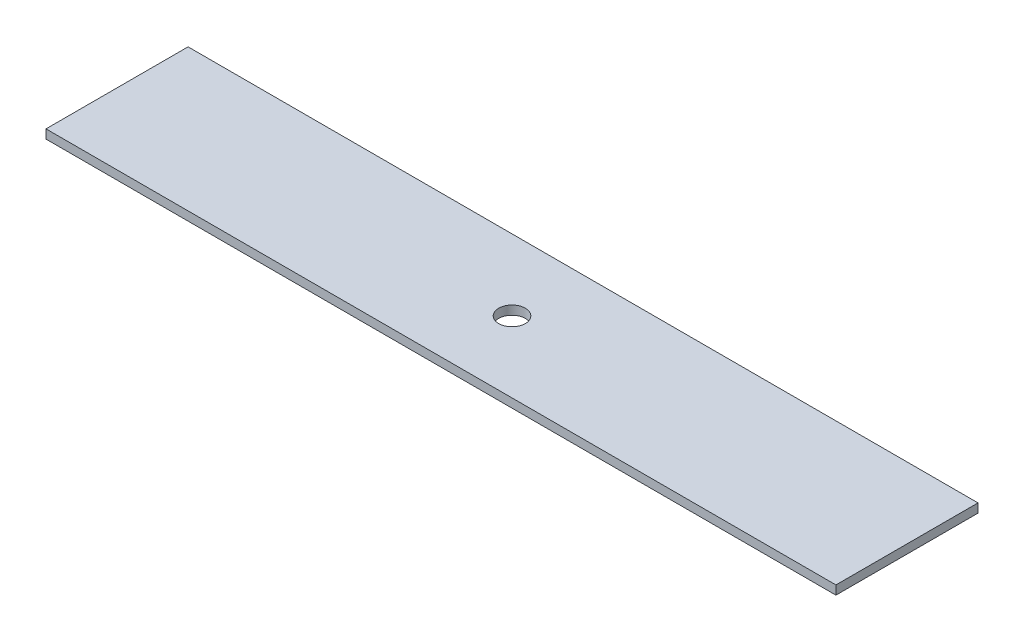
ISO-10303-21;
HEADER;
FILE_DESCRIPTION(('STEP AP214'),'2;1');
FILE_NAME('part.step','',(''),(''),'','','');
FILE_SCHEMA(('AUTOMOTIVE_DESIGN { 1 0 10303 214 1 1 1 1 }'));
ENDSEC;
DATA;
#1=APPLICATION_CONTEXT('core data for automotive mechanical design processes');
#2=APPLICATION_PROTOCOL_DEFINITION('international standard','automotive_design',2000,#1);
#3=PRODUCT_CONTEXT('',#1,'mechanical');
#4=PRODUCT('Part','Part','',(#3));
#5=PRODUCT_RELATED_PRODUCT_CATEGORY('part','',(#4));
#6=PRODUCT_DEFINITION_FORMATION('','',#4);
#7=PRODUCT_DEFINITION_CONTEXT('part definition',#1,'design');
#8=PRODUCT_DEFINITION('design','',#6,#7);
#9=PRODUCT_DEFINITION_SHAPE('','',#8);
#10=(LENGTH_UNIT() NAMED_UNIT(*) SI_UNIT(.MILLI.,.METRE.));
#11=(NAMED_UNIT(*) PLANE_ANGLE_UNIT() SI_UNIT($,.RADIAN.));
#12=(NAMED_UNIT(*) SI_UNIT($,.STERADIAN.) SOLID_ANGLE_UNIT());
#13=UNCERTAINTY_MEASURE_WITH_UNIT(LENGTH_MEASURE(1.E-05),#10,'distance_accuracy_value','');
#14=(GEOMETRIC_REPRESENTATION_CONTEXT(3) GLOBAL_UNCERTAINTY_ASSIGNED_CONTEXT((#13)) GLOBAL_UNIT_ASSIGNED_CONTEXT((#10,
#11,#12)) REPRESENTATION_CONTEXT('',''));
#15=CARTESIAN_POINT('',(0.,0.,0.));
#16=DIRECTION('',(0.,0.,1.));
#17=DIRECTION('',(1.,0.,0.));
#18=AXIS2_PLACEMENT_3D('',#15,#16,#17);
#19=CARTESIAN_POINT('',(141.224,3.175,-25.4));
#20=DIRECTION('',(-1.,0.,0.));
#21=DIRECTION('',(0.,0.,1.));
#22=AXIS2_PLACEMENT_3D('',#19,#20,#21);
#23=PLANE('',#22);
#24=DIRECTION('',(0.,0.,-1.));
#25=VECTOR('',#24,1.);
#26=CARTESIAN_POINT('',(141.224,0.,-25.4));
#27=LINE('',#26,#25);
#28=CARTESIAN_POINT('',(141.224,0.,25.4));
#29=VERTEX_POINT('',#28);
#30=CARTESIAN_POINT('',(141.224,0.,-25.4));
#31=VERTEX_POINT('',#30);
#32=EDGE_CURVE('E96',#29,#31,#27,.T.);
#33=ORIENTED_EDGE('',*,*,#32,.T.);
#34=DIRECTION('',(0.,-1.,0.));
#35=VECTOR('',#34,1.);
#36=CARTESIAN_POINT('',(141.224,3.175,-25.4));
#37=LINE('',#36,#35);
#38=CARTESIAN_POINT('',(141.224,3.175,-25.4));
#39=VERTEX_POINT('',#38);
#40=EDGE_CURVE('E11',#39,#31,#37,.T.);
#41=ORIENTED_EDGE('',*,*,#40,.F.);
#42=DIRECTION('',(0.,0.,-1.));
#43=VECTOR('',#42,1.);
#44=CARTESIAN_POINT('',(141.224,3.175,-25.4));
#45=LINE('',#44,#43);
#46=CARTESIAN_POINT('',(141.224,3.175,25.4));
#47=VERTEX_POINT('',#46);
#48=EDGE_CURVE('E84',#47,#39,#45,.T.);
#49=ORIENTED_EDGE('',*,*,#48,.F.);
#50=DIRECTION('',(0.,-1.,0.));
#51=VECTOR('',#50,1.);
#52=CARTESIAN_POINT('',(141.224,3.175,25.4));
#53=LINE('',#52,#51);
#54=EDGE_CURVE('E92',#47,#29,#53,.T.);
#55=ORIENTED_EDGE('',*,*,#54,.T.);
#56=EDGE_LOOP('',(#33,#41,#49,#55));
#57=FACE_BOUND('',#56,.T.);
#58=ADVANCED_FACE('F33',(#57),#23,.F.);
#59=CARTESIAN_POINT('',(-141.224,3.175,-25.4));
#60=DIRECTION('',(0.,0.,1.));
#61=DIRECTION('',(1.,0.,0.));
#62=AXIS2_PLACEMENT_3D('',#59,#60,#61);
#63=PLANE('',#62);
#64=DIRECTION('',(-1.,0.,0.));
#65=VECTOR('',#64,1.);
#66=CARTESIAN_POINT('',(-141.224,0.,-25.4));
#67=LINE('',#66,#65);
#68=CARTESIAN_POINT('',(-141.224,0.,-25.4));
#69=VERTEX_POINT('',#68);
#70=EDGE_CURVE('E88',#31,#69,#67,.T.);
#71=ORIENTED_EDGE('',*,*,#70,.T.);
#72=DIRECTION('',(0.,-1.,0.));
#73=VECTOR('',#72,1.);
#74=CARTESIAN_POINT('',(-141.224,3.175,-25.4));
#75=LINE('',#74,#73);
#76=CARTESIAN_POINT('',(-141.224,3.175,-25.4));
#77=VERTEX_POINT('',#76);
#78=EDGE_CURVE('E41',#77,#69,#75,.T.);
#79=ORIENTED_EDGE('',*,*,#78,.F.);
#80=DIRECTION('',(-1.,0.,0.));
#81=VECTOR('',#80,1.);
#82=CARTESIAN_POINT('',(-141.224,3.175,-25.4));
#83=LINE('',#82,#81);
#84=EDGE_CURVE('E79',#39,#77,#83,.T.);
#85=ORIENTED_EDGE('',*,*,#84,.F.);
#86=ORIENTED_EDGE('',*,*,#40,.T.);
#87=EDGE_LOOP('',(#71,#79,#85,#86));
#88=FACE_BOUND('',#87,.T.);
#89=ADVANCED_FACE('F87',(#88),#63,.F.);
#90=CARTESIAN_POINT('',(-141.224,3.175,-25.4));
#91=DIRECTION('',(1.,0.,0.));
#92=DIRECTION('',(0.,0.,-1.));
#93=AXIS2_PLACEMENT_3D('',#90,#91,#92);
#94=PLANE('',#93);
#95=DIRECTION('',(0.,0.,1.));
#96=VECTOR('',#95,1.);
#97=CARTESIAN_POINT('',(-141.224,0.,-25.4));
#98=LINE('',#97,#96);
#99=CARTESIAN_POINT('',(-141.224,0.,25.4));
#100=VERTEX_POINT('',#99);
#101=EDGE_CURVE('E66',#69,#100,#98,.T.);
#102=ORIENTED_EDGE('',*,*,#101,.T.);
#103=DIRECTION('',(0.,-1.,0.));
#104=VECTOR('',#103,1.);
#105=CARTESIAN_POINT('',(-141.224,3.175,25.4));
#106=LINE('',#105,#104);
#107=CARTESIAN_POINT('',(-141.224,3.175,25.4));
#108=VERTEX_POINT('',#107);
#109=EDGE_CURVE('E89',#108,#100,#106,.T.);
#110=ORIENTED_EDGE('',*,*,#109,.F.);
#111=DIRECTION('',(0.,0.,1.));
#112=VECTOR('',#111,1.);
#113=CARTESIAN_POINT('',(-141.224,3.175,-25.4));
#114=LINE('',#113,#112);
#115=EDGE_CURVE('E82',#77,#108,#114,.T.);
#116=ORIENTED_EDGE('',*,*,#115,.F.);
#117=ORIENTED_EDGE('',*,*,#78,.T.);
#118=EDGE_LOOP('',(#102,#110,#116,#117));
#119=FACE_BOUND('',#118,.T.);
#120=ADVANCED_FACE('F90',(#119),#94,.F.);
#121=CARTESIAN_POINT('',(-141.224,3.175,25.4));
#122=DIRECTION('',(0.,0.,-1.));
#123=DIRECTION('',(-1.,0.,0.));
#124=AXIS2_PLACEMENT_3D('',#121,#122,#123);
#125=PLANE('',#124);
#126=DIRECTION('',(1.,0.,0.));
#127=VECTOR('',#126,1.);
#128=CARTESIAN_POINT('',(-141.224,0.,25.4));
#129=LINE('',#128,#127);
#130=EDGE_CURVE('E72',#100,#29,#129,.T.);
#131=ORIENTED_EDGE('',*,*,#130,.T.);
#132=ORIENTED_EDGE('',*,*,#54,.F.);
#133=DIRECTION('',(1.,0.,0.));
#134=VECTOR('',#133,1.);
#135=CARTESIAN_POINT('',(-141.224,3.175,25.4));
#136=LINE('',#135,#134);
#137=EDGE_CURVE('E49',#108,#47,#136,.T.);
#138=ORIENTED_EDGE('',*,*,#137,.F.);
#139=ORIENTED_EDGE('',*,*,#109,.T.);
#140=EDGE_LOOP('',(#131,#132,#138,#139));
#141=FACE_BOUND('',#140,.T.);
#142=ADVANCED_FACE('F104',(#141),#125,.F.);
#143=CARTESIAN_POINT('',(0.,3.175,0.));
#144=DIRECTION('',(0.,1.,0.));
#145=DIRECTION('',(0.,0.,1.));
#146=AXIS2_PLACEMENT_3D('',#143,#144,#145);
#147=PLANE('',#146);
#148=CARTESIAN_POINT('',(0.,3.175,0.));
#149=DIRECTION('',(0.,1.,0.));
#150=DIRECTION('',(0.,0.,1.));
#151=AXIS2_PLACEMENT_3D('',#148,#149,#150);
#152=CIRCLE('',#151,4.7625);
#153=CARTESIAN_POINT('',(0.,3.175,4.7625));
#154=VERTEX_POINT('',#153);
#155=EDGE_CURVE('E112',#154,#154,#152,.T.);
#156=ORIENTED_EDGE('',*,*,#155,.F.);
#157=EDGE_LOOP('',(#156));
#158=FACE_BOUND('',#157,.T.);
#159=ORIENTED_EDGE('',*,*,#48,.T.);
#160=ORIENTED_EDGE('',*,*,#84,.T.);
#161=ORIENTED_EDGE('',*,*,#115,.T.);
#162=ORIENTED_EDGE('',*,*,#137,.T.);
#163=EDGE_LOOP('',(#159,#160,#161,#162));
#164=FACE_BOUND('',#163,.T.);
#165=ADVANCED_FACE('F80',(#158,#164),#147,.T.);
#166=CARTESIAN_POINT('',(0.,0.,0.));
#167=DIRECTION('',(0.,1.,0.));
#168=DIRECTION('',(0.,0.,1.));
#169=AXIS2_PLACEMENT_3D('',#166,#167,#168);
#170=PLANE('',#169);
#171=CARTESIAN_POINT('',(0.,0.,0.));
#172=DIRECTION('',(0.,1.,0.));
#173=DIRECTION('',(0.,0.,1.));
#174=AXIS2_PLACEMENT_3D('',#171,#172,#173);
#175=CIRCLE('',#174,4.7625);
#176=CARTESIAN_POINT('',(0.,0.,4.7625));
#177=VERTEX_POINT('',#176);
#178=EDGE_CURVE('E99',#177,#177,#175,.F.);
#179=ORIENTED_EDGE('',*,*,#178,.F.);
#180=EDGE_LOOP('',(#179));
#181=FACE_BOUND('',#180,.T.);
#182=ORIENTED_EDGE('',*,*,#32,.F.);
#183=ORIENTED_EDGE('',*,*,#130,.F.);
#184=ORIENTED_EDGE('',*,*,#101,.F.);
#185=ORIENTED_EDGE('',*,*,#70,.F.);
#186=EDGE_LOOP('',(#182,#183,#184,#185));
#187=FACE_BOUND('',#186,.T.);
#188=ADVANCED_FACE('F107',(#181,#187),#170,.F.);
#189=CARTESIAN_POINT('',(0.,-0.00100000000000013,0.));
#190=DIRECTION('',(0.,1.,0.));
#191=DIRECTION('',(0.,0.,1.));
#192=AXIS2_PLACEMENT_3D('',#189,#190,#191);
#193=CYLINDRICAL_SURFACE('',#192,4.7625);
#194=ORIENTED_EDGE('',*,*,#155,.T.);
#195=EDGE_LOOP('',(#194));
#196=FACE_BOUND('',#195,.T.);
#197=ORIENTED_EDGE('',*,*,#178,.T.);
#198=EDGE_LOOP('',(#197));
#199=FACE_BOUND('',#198,.T.);
#200=ADVANCED_FACE('F116',(#196,#199),#193,.F.);
#201=CLOSED_SHELL('',(#58,#89,#120,#142,#165,#188,#200));
#202=MANIFOLD_SOLID_BREP('B2',#201);
#203=ADVANCED_BREP_SHAPE_REPRESENTATION('',(#18,#202),#14);
#204=SHAPE_DEFINITION_REPRESENTATION(#9,#203);
ENDSEC;
END-ISO-10303-21;
